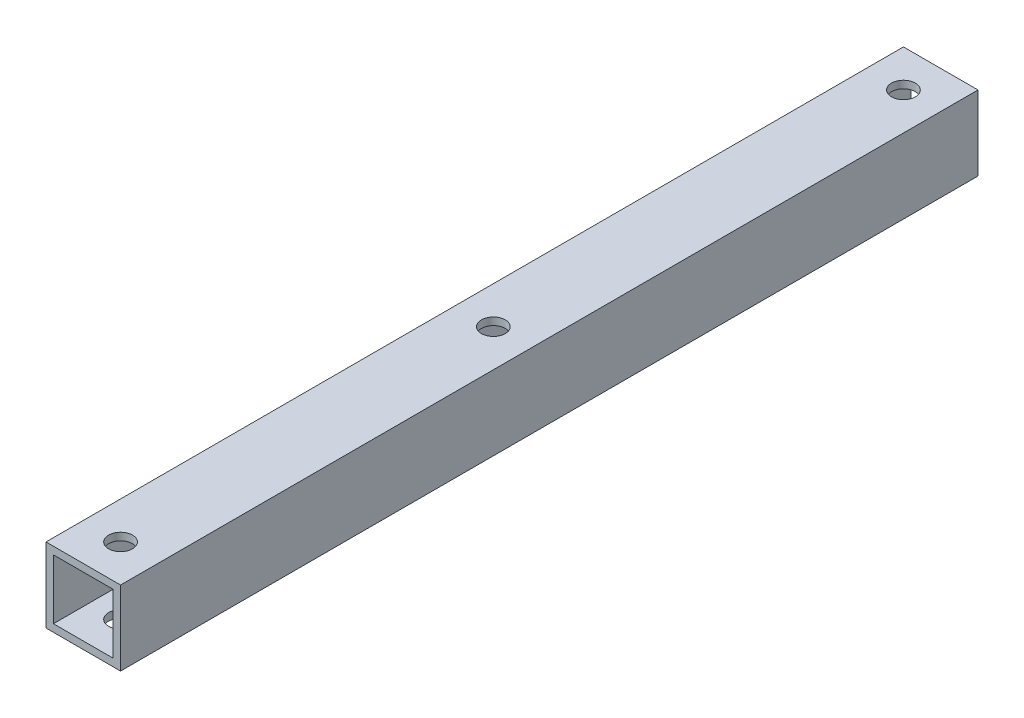
ISO-10303-21;
HEADER;
FILE_DESCRIPTION(('STEP AP214'),'2;1');
FILE_NAME('part.step','',(''),(''),'','','');
FILE_SCHEMA(('AUTOMOTIVE_DESIGN { 1 0 10303 214 1 1 1 1 }'));
ENDSEC;
DATA;
#1=APPLICATION_CONTEXT('core data for automotive mechanical design processes');
#2=APPLICATION_PROTOCOL_DEFINITION('international standard','automotive_design',2000,#1);
#3=PRODUCT_CONTEXT('',#1,'mechanical');
#4=PRODUCT('Part','Part','',(#3));
#5=PRODUCT_RELATED_PRODUCT_CATEGORY('part','',(#4));
#6=PRODUCT_DEFINITION_FORMATION('','',#4);
#7=PRODUCT_DEFINITION_CONTEXT('part definition',#1,'design');
#8=PRODUCT_DEFINITION('design','',#6,#7);
#9=PRODUCT_DEFINITION_SHAPE('','',#8);
#10=(LENGTH_UNIT() NAMED_UNIT(*) SI_UNIT(.MILLI.,.METRE.));
#11=(NAMED_UNIT(*) PLANE_ANGLE_UNIT() SI_UNIT($,.RADIAN.));
#12=(NAMED_UNIT(*) SI_UNIT($,.STERADIAN.) SOLID_ANGLE_UNIT());
#13=UNCERTAINTY_MEASURE_WITH_UNIT(LENGTH_MEASURE(1.E-05),#10,'distance_accuracy_value','');
#14=(GEOMETRIC_REPRESENTATION_CONTEXT(3) GLOBAL_UNCERTAINTY_ASSIGNED_CONTEXT((#13)) GLOBAL_UNIT_ASSIGNED_CONTEXT((#10,
#11,#12)) REPRESENTATION_CONTEXT('',''));
#15=CARTESIAN_POINT('',(0.,0.,0.));
#16=DIRECTION('',(0.,0.,1.));
#17=DIRECTION('',(1.,0.,0.));
#18=AXIS2_PLACEMENT_3D('',#15,#16,#17);
#19=CARTESIAN_POINT('',(0.,0.,115.));
#20=DIRECTION('',(0.,0.,1.));
#21=DIRECTION('',(1.,0.,0.));
#22=AXIS2_PLACEMENT_3D('',#19,#20,#21);
#23=PLANE('',#22);
#24=DIRECTION('',(0.,1.,0.));
#25=VECTOR('',#24,1.);
#26=CARTESIAN_POINT('',(5.,-5.,115.));
#27=LINE('',#26,#25);
#28=CARTESIAN_POINT('',(5.,-5.,115.));
#29=VERTEX_POINT('',#28);
#30=CARTESIAN_POINT('',(5.,5.,115.));
#31=VERTEX_POINT('',#30);
#32=EDGE_CURVE('E164',#29,#31,#27,.T.);
#33=ORIENTED_EDGE('',*,*,#32,.T.);
#34=DIRECTION('',(-1.,0.,0.));
#35=VECTOR('',#34,1.);
#36=CARTESIAN_POINT('',(-5.,5.,115.));
#37=LINE('',#36,#35);
#38=CARTESIAN_POINT('',(-5.,5.,115.));
#39=VERTEX_POINT('',#38);
#40=EDGE_CURVE('E167',#31,#39,#37,.T.);
#41=ORIENTED_EDGE('',*,*,#40,.T.);
#42=DIRECTION('',(0.,-1.,0.));
#43=VECTOR('',#42,1.);
#44=CARTESIAN_POINT('',(-5.,-5.,115.));
#45=LINE('',#44,#43);
#46=CARTESIAN_POINT('',(-5.,-5.,115.));
#47=VERTEX_POINT('',#46);
#48=EDGE_CURVE('E170',#39,#47,#45,.T.);
#49=ORIENTED_EDGE('',*,*,#48,.T.);
#50=DIRECTION('',(1.,0.,0.));
#51=VECTOR('',#50,1.);
#52=CARTESIAN_POINT('',(-5.,-5.,115.));
#53=LINE('',#52,#51);
#54=EDGE_CURVE('E172',#47,#29,#53,.T.);
#55=ORIENTED_EDGE('',*,*,#54,.T.);
#56=EDGE_LOOP('',(#33,#41,#49,#55));
#57=FACE_BOUND('',#56,.T.);
#58=DIRECTION('',(-1.,0.,0.));
#59=VECTOR('',#58,1.);
#60=CARTESIAN_POINT('',(0.,4.,115.));
#61=LINE('',#60,#59);
#62=CARTESIAN_POINT('',(4.,4.,115.));
#63=VERTEX_POINT('',#62);
#64=CARTESIAN_POINT('',(-4.,4.,115.));
#65=VERTEX_POINT('',#64);
#66=EDGE_CURVE('E134',#63,#65,#61,.T.);
#67=ORIENTED_EDGE('',*,*,#66,.F.);
#68=DIRECTION('',(0.,1.,0.));
#69=VECTOR('',#68,1.);
#70=CARTESIAN_POINT('',(4.,0.,115.));
#71=LINE('',#70,#69);
#72=CARTESIAN_POINT('',(4.,-4.,115.));
#73=VERTEX_POINT('',#72);
#74=EDGE_CURVE('E126',#73,#63,#71,.T.);
#75=ORIENTED_EDGE('',*,*,#74,.F.);
#76=DIRECTION('',(1.,0.,0.));
#77=VECTOR('',#76,1.);
#78=CARTESIAN_POINT('',(0.,-4.,115.));
#79=LINE('',#78,#77);
#80=CARTESIAN_POINT('',(-4.,-4.,115.));
#81=VERTEX_POINT('',#80);
#82=EDGE_CURVE('E148',#81,#73,#79,.T.);
#83=ORIENTED_EDGE('',*,*,#82,.F.);
#84=DIRECTION('',(0.,-1.,0.));
#85=VECTOR('',#84,1.);
#86=CARTESIAN_POINT('',(-4.,0.,115.));
#87=LINE('',#86,#85);
#88=EDGE_CURVE('E146',#65,#81,#87,.T.);
#89=ORIENTED_EDGE('',*,*,#88,.F.);
#90=EDGE_LOOP('',(#67,#75,#83,#89));
#91=FACE_BOUND('',#90,.T.);
#92=ADVANCED_FACE('F59',(#57,#91),#23,.T.);
#93=CARTESIAN_POINT('',(0.,0.,0.));
#94=DIRECTION('',(0.,0.,1.));
#95=DIRECTION('',(1.,0.,0.));
#96=AXIS2_PLACEMENT_3D('',#93,#94,#95);
#97=PLANE('',#96);
#98=DIRECTION('',(0.,1.,0.));
#99=VECTOR('',#98,1.);
#100=CARTESIAN_POINT('',(5.,-5.,0.));
#101=LINE('',#100,#99);
#102=CARTESIAN_POINT('',(5.,-5.,0.));
#103=VERTEX_POINT('',#102);
#104=CARTESIAN_POINT('',(5.,5.,0.));
#105=VERTEX_POINT('',#104);
#106=EDGE_CURVE('E142',#103,#105,#101,.T.);
#107=ORIENTED_EDGE('',*,*,#106,.F.);
#108=DIRECTION('',(1.,0.,0.));
#109=VECTOR('',#108,1.);
#110=CARTESIAN_POINT('',(-5.,-5.,0.));
#111=LINE('',#110,#109);
#112=CARTESIAN_POINT('',(-5.,-5.,0.));
#113=VERTEX_POINT('',#112);
#114=EDGE_CURVE('E168',#113,#103,#111,.T.);
#115=ORIENTED_EDGE('',*,*,#114,.F.);
#116=DIRECTION('',(0.,-1.,0.));
#117=VECTOR('',#116,1.);
#118=CARTESIAN_POINT('',(-5.,-5.,0.));
#119=LINE('',#118,#117);
#120=CARTESIAN_POINT('',(-5.,5.,0.));
#121=VERTEX_POINT('',#120);
#122=EDGE_CURVE('E179',#121,#113,#119,.T.);
#123=ORIENTED_EDGE('',*,*,#122,.F.);
#124=DIRECTION('',(-1.,0.,0.));
#125=VECTOR('',#124,1.);
#126=CARTESIAN_POINT('',(-5.,5.,0.));
#127=LINE('',#126,#125);
#128=EDGE_CURVE('E177',#105,#121,#127,.T.);
#129=ORIENTED_EDGE('',*,*,#128,.F.);
#130=EDGE_LOOP('',(#107,#115,#123,#129));
#131=FACE_BOUND('',#130,.T.);
#132=DIRECTION('',(0.,1.,0.));
#133=VECTOR('',#132,1.);
#134=CARTESIAN_POINT('',(4.,0.,0.));
#135=LINE('',#134,#133);
#136=CARTESIAN_POINT('',(4.,-4.,0.));
#137=VERTEX_POINT('',#136);
#138=CARTESIAN_POINT('',(4.,4.,0.));
#139=VERTEX_POINT('',#138);
#140=EDGE_CURVE('E84',#137,#139,#135,.T.);
#141=ORIENTED_EDGE('',*,*,#140,.T.);
#142=DIRECTION('',(-1.,0.,0.));
#143=VECTOR('',#142,1.);
#144=CARTESIAN_POINT('',(0.,4.,0.));
#145=LINE('',#144,#143);
#146=CARTESIAN_POINT('',(-4.,4.,0.));
#147=VERTEX_POINT('',#146);
#148=EDGE_CURVE('E141',#139,#147,#145,.T.);
#149=ORIENTED_EDGE('',*,*,#148,.T.);
#150=DIRECTION('',(0.,-1.,0.));
#151=VECTOR('',#150,1.);
#152=CARTESIAN_POINT('',(-4.,0.,0.));
#153=LINE('',#152,#151);
#154=CARTESIAN_POINT('',(-4.,-4.,0.));
#155=VERTEX_POINT('',#154);
#156=EDGE_CURVE('E156',#147,#155,#153,.T.);
#157=ORIENTED_EDGE('',*,*,#156,.T.);
#158=DIRECTION('',(1.,0.,0.));
#159=VECTOR('',#158,1.);
#160=CARTESIAN_POINT('',(0.,-4.,0.));
#161=LINE('',#160,#159);
#162=EDGE_CURVE('E135',#155,#137,#161,.T.);
#163=ORIENTED_EDGE('',*,*,#162,.T.);
#164=EDGE_LOOP('',(#141,#149,#157,#163));
#165=FACE_BOUND('',#164,.T.);
#166=ADVANCED_FACE('F226',(#131,#165),#97,.F.);
#167=CARTESIAN_POINT('',(5.,-5.,115.));
#168=DIRECTION('',(-1.,0.,0.));
#169=DIRECTION('',(0.,0.,1.));
#170=AXIS2_PLACEMENT_3D('',#167,#168,#169);
#171=PLANE('',#170);
#172=ORIENTED_EDGE('',*,*,#106,.T.);
#173=DIRECTION('',(0.,0.,-1.));
#174=VECTOR('',#173,1.);
#175=CARTESIAN_POINT('',(5.,5.,115.));
#176=LINE('',#175,#174);
#177=EDGE_CURVE('E12',#31,#105,#176,.T.);
#178=ORIENTED_EDGE('',*,*,#177,.F.);
#179=ORIENTED_EDGE('',*,*,#32,.F.);
#180=DIRECTION('',(0.,0.,-1.));
#181=VECTOR('',#180,1.);
#182=CARTESIAN_POINT('',(5.,-5.,115.));
#183=LINE('',#182,#181);
#184=EDGE_CURVE('E174',#29,#103,#183,.T.);
#185=ORIENTED_EDGE('',*,*,#184,.T.);
#186=EDGE_LOOP('',(#172,#178,#179,#185));
#187=FACE_BOUND('',#186,.T.);
#188=ADVANCED_FACE('F61',(#187),#171,.F.);
#189=CARTESIAN_POINT('',(-5.,5.,115.));
#190=DIRECTION('',(0.,-1.,0.));
#191=DIRECTION('',(0.,0.,-1.));
#192=AXIS2_PLACEMENT_3D('',#189,#190,#191);
#193=PLANE('',#192);
#194=CARTESIAN_POINT('',(0.,5.,5.));
#195=DIRECTION('',(0.,1.,0.));
#196=DIRECTION('',(0.,0.,1.));
#197=AXIS2_PLACEMENT_3D('',#194,#195,#196);
#198=CIRCLE('',#197,1.6);
#199=CARTESIAN_POINT('',(0.,5.,6.6));
#200=VERTEX_POINT('',#199);
#201=EDGE_CURVE('E262',#200,#200,#198,.T.);
#202=ORIENTED_EDGE('',*,*,#201,.F.);
#203=EDGE_LOOP('',(#202));
#204=FACE_BOUND('',#203,.T.);
#205=CARTESIAN_POINT('',(0.,5.,60.));
#206=DIRECTION('',(0.,1.,0.));
#207=DIRECTION('',(0.,0.,1.));
#208=AXIS2_PLACEMENT_3D('',#205,#206,#207);
#209=CIRCLE('',#208,1.6);
#210=CARTESIAN_POINT('',(0.,5.,61.6));
#211=VERTEX_POINT('',#210);
#212=EDGE_CURVE('E266',#211,#211,#209,.T.);
#213=ORIENTED_EDGE('',*,*,#212,.F.);
#214=EDGE_LOOP('',(#213));
#215=FACE_BOUND('',#214,.T.);
#216=CARTESIAN_POINT('',(0.,5.,110.));
#217=DIRECTION('',(0.,1.,0.));
#218=DIRECTION('',(0.,0.,1.));
#219=AXIS2_PLACEMENT_3D('',#216,#217,#218);
#220=CIRCLE('',#219,1.6);
#221=CARTESIAN_POINT('',(0.,5.,111.6));
#222=VERTEX_POINT('',#221);
#223=EDGE_CURVE('E205',#222,#222,#220,.T.);
#224=ORIENTED_EDGE('',*,*,#223,.F.);
#225=EDGE_LOOP('',(#224));
#226=FACE_BOUND('',#225,.T.);
#227=ORIENTED_EDGE('',*,*,#128,.T.);
#228=DIRECTION('',(0.,0.,-1.));
#229=VECTOR('',#228,1.);
#230=CARTESIAN_POINT('',(-5.,5.,115.));
#231=LINE('',#230,#229);
#232=EDGE_CURVE('E68',#39,#121,#231,.T.);
#233=ORIENTED_EDGE('',*,*,#232,.F.);
#234=ORIENTED_EDGE('',*,*,#40,.F.);
#235=ORIENTED_EDGE('',*,*,#177,.T.);
#236=EDGE_LOOP('',(#227,#233,#234,#235));
#237=FACE_BOUND('',#236,.T.);
#238=ADVANCED_FACE('F251',(#204,#215,#226,#237),#193,.F.);
#239=CARTESIAN_POINT('',(-5.,-5.,115.));
#240=DIRECTION('',(1.,0.,0.));
#241=DIRECTION('',(0.,0.,-1.));
#242=AXIS2_PLACEMENT_3D('',#239,#240,#241);
#243=PLANE('',#242);
#244=ORIENTED_EDGE('',*,*,#122,.T.);
#245=DIRECTION('',(0.,0.,-1.));
#246=VECTOR('',#245,1.);
#247=CARTESIAN_POINT('',(-5.,-5.,115.));
#248=LINE('',#247,#246);
#249=EDGE_CURVE('E184',#47,#113,#248,.T.);
#250=ORIENTED_EDGE('',*,*,#249,.F.);
#251=ORIENTED_EDGE('',*,*,#48,.F.);
#252=ORIENTED_EDGE('',*,*,#232,.T.);
#253=EDGE_LOOP('',(#244,#250,#251,#252));
#254=FACE_BOUND('',#253,.T.);
#255=ADVANCED_FACE('F248',(#254),#243,.F.);
#256=CARTESIAN_POINT('',(-5.,-5.,115.));
#257=DIRECTION('',(0.,1.,0.));
#258=DIRECTION('',(0.,0.,1.));
#259=AXIS2_PLACEMENT_3D('',#256,#257,#258);
#260=PLANE('',#259);
#261=CARTESIAN_POINT('',(0.,-5.,5.));
#262=DIRECTION('',(0.,1.,0.));
#263=DIRECTION('',(0.,0.,1.));
#264=AXIS2_PLACEMENT_3D('',#261,#262,#263);
#265=CIRCLE('',#264,1.6);
#266=CARTESIAN_POINT('',(0.,-5.,6.6));
#267=VERTEX_POINT('',#266);
#268=EDGE_CURVE('E192',#267,#267,#265,.T.);
#269=ORIENTED_EDGE('',*,*,#268,.T.);
#270=EDGE_LOOP('',(#269));
#271=FACE_BOUND('',#270,.T.);
#272=CARTESIAN_POINT('',(0.,-5.,60.));
#273=DIRECTION('',(0.,1.,0.));
#274=DIRECTION('',(0.,0.,1.));
#275=AXIS2_PLACEMENT_3D('',#272,#273,#274);
#276=CIRCLE('',#275,1.6);
#277=CARTESIAN_POINT('',(0.,-5.,61.6));
#278=VERTEX_POINT('',#277);
#279=EDGE_CURVE('E286',#278,#278,#276,.T.);
#280=ORIENTED_EDGE('',*,*,#279,.T.);
#281=EDGE_LOOP('',(#280));
#282=FACE_BOUND('',#281,.T.);
#283=CARTESIAN_POINT('',(0.,-5.,110.));
#284=DIRECTION('',(0.,1.,0.));
#285=DIRECTION('',(0.,0.,1.));
#286=AXIS2_PLACEMENT_3D('',#283,#284,#285);
#287=CIRCLE('',#286,1.6);
#288=CARTESIAN_POINT('',(0.,-5.,111.6));
#289=VERTEX_POINT('',#288);
#290=EDGE_CURVE('E282',#289,#289,#287,.T.);
#291=ORIENTED_EDGE('',*,*,#290,.T.);
#292=EDGE_LOOP('',(#291));
#293=FACE_BOUND('',#292,.T.);
#294=ORIENTED_EDGE('',*,*,#114,.T.);
#295=ORIENTED_EDGE('',*,*,#184,.F.);
#296=ORIENTED_EDGE('',*,*,#54,.F.);
#297=ORIENTED_EDGE('',*,*,#249,.T.);
#298=EDGE_LOOP('',(#294,#295,#296,#297));
#299=FACE_BOUND('',#298,.T.);
#300=ADVANCED_FACE('F245',(#271,#282,#293,#299),#260,.F.);
#301=CARTESIAN_POINT('',(4.,0.,115.));
#302=DIRECTION('',(-1.,0.,0.));
#303=DIRECTION('',(0.,0.,1.));
#304=AXIS2_PLACEMENT_3D('',#301,#302,#303);
#305=PLANE('',#304);
#306=ORIENTED_EDGE('',*,*,#140,.F.);
#307=DIRECTION('',(0.,0.,-1.));
#308=VECTOR('',#307,1.);
#309=CARTESIAN_POINT('',(4.,-4.,115.));
#310=LINE('',#309,#308);
#311=EDGE_CURVE('E130',#73,#137,#310,.T.);
#312=ORIENTED_EDGE('',*,*,#311,.F.);
#313=ORIENTED_EDGE('',*,*,#74,.T.);
#314=DIRECTION('',(0.,0.,-1.));
#315=VECTOR('',#314,1.);
#316=CARTESIAN_POINT('',(4.,4.,115.));
#317=LINE('',#316,#315);
#318=EDGE_CURVE('E129',#63,#139,#317,.T.);
#319=ORIENTED_EDGE('',*,*,#318,.T.);
#320=EDGE_LOOP('',(#306,#312,#313,#319));
#321=FACE_BOUND('',#320,.T.);
#322=ADVANCED_FACE('F128',(#321),#305,.T.);
#323=CARTESIAN_POINT('',(0.,4.,115.));
#324=DIRECTION('',(0.,-1.,0.));
#325=DIRECTION('',(0.,0.,-1.));
#326=AXIS2_PLACEMENT_3D('',#323,#324,#325);
#327=PLANE('',#326);
#328=CARTESIAN_POINT('',(0.,4.,5.));
#329=DIRECTION('',(0.,-1.,0.));
#330=DIRECTION('',(0.,0.,-1.));
#331=AXIS2_PLACEMENT_3D('',#328,#329,#330);
#332=CIRCLE('',#331,1.6);
#333=CARTESIAN_POINT('',(0.,4.,3.4));
#334=VERTEX_POINT('',#333);
#335=EDGE_CURVE('E154',#334,#334,#332,.T.);
#336=ORIENTED_EDGE('',*,*,#335,.F.);
#337=EDGE_LOOP('',(#336));
#338=FACE_BOUND('',#337,.T.);
#339=CARTESIAN_POINT('',(0.,4.,60.));
#340=DIRECTION('',(0.,-1.,0.));
#341=DIRECTION('',(0.,0.,-1.));
#342=AXIS2_PLACEMENT_3D('',#339,#340,#341);
#343=CIRCLE('',#342,1.6);
#344=CARTESIAN_POINT('',(0.,4.,58.4));
#345=VERTEX_POINT('',#344);
#346=EDGE_CURVE('E195',#345,#345,#343,.T.);
#347=ORIENTED_EDGE('',*,*,#346,.F.);
#348=EDGE_LOOP('',(#347));
#349=FACE_BOUND('',#348,.T.);
#350=CARTESIAN_POINT('',(0.,4.,110.));
#351=DIRECTION('',(0.,-1.,0.));
#352=DIRECTION('',(0.,0.,-1.));
#353=AXIS2_PLACEMENT_3D('',#350,#351,#352);
#354=CIRCLE('',#353,1.6);
#355=CARTESIAN_POINT('',(0.,4.,108.4));
#356=VERTEX_POINT('',#355);
#357=EDGE_CURVE('E191',#356,#356,#354,.T.);
#358=ORIENTED_EDGE('',*,*,#357,.F.);
#359=EDGE_LOOP('',(#358));
#360=FACE_BOUND('',#359,.T.);
#361=ORIENTED_EDGE('',*,*,#148,.F.);
#362=ORIENTED_EDGE('',*,*,#318,.F.);
#363=ORIENTED_EDGE('',*,*,#66,.T.);
#364=DIRECTION('',(0.,0.,-1.));
#365=VECTOR('',#364,1.);
#366=CARTESIAN_POINT('',(-4.,4.,115.));
#367=LINE('',#366,#365);
#368=EDGE_CURVE('E143',#65,#147,#367,.T.);
#369=ORIENTED_EDGE('',*,*,#368,.T.);
#370=EDGE_LOOP('',(#361,#362,#363,#369));
#371=FACE_BOUND('',#370,.T.);
#372=ADVANCED_FACE('F138',(#338,#349,#360,#371),#327,.T.);
#373=CARTESIAN_POINT('',(-4.,0.,115.));
#374=DIRECTION('',(1.,0.,0.));
#375=DIRECTION('',(0.,0.,-1.));
#376=AXIS2_PLACEMENT_3D('',#373,#374,#375);
#377=PLANE('',#376);
#378=ORIENTED_EDGE('',*,*,#156,.F.);
#379=ORIENTED_EDGE('',*,*,#368,.F.);
#380=ORIENTED_EDGE('',*,*,#88,.T.);
#381=DIRECTION('',(0.,0.,-1.));
#382=VECTOR('',#381,1.);
#383=CARTESIAN_POINT('',(-4.,-4.,115.));
#384=LINE('',#383,#382);
#385=EDGE_CURVE('E76',#81,#155,#384,.T.);
#386=ORIENTED_EDGE('',*,*,#385,.T.);
#387=EDGE_LOOP('',(#378,#379,#380,#386));
#388=FACE_BOUND('',#387,.T.);
#389=ADVANCED_FACE('F220',(#388),#377,.T.);
#390=CARTESIAN_POINT('',(0.,-4.,115.));
#391=DIRECTION('',(0.,1.,0.));
#392=DIRECTION('',(0.,0.,1.));
#393=AXIS2_PLACEMENT_3D('',#390,#391,#392);
#394=PLANE('',#393);
#395=CARTESIAN_POINT('',(0.,-4.,5.));
#396=DIRECTION('',(0.,1.,0.));
#397=DIRECTION('',(0.,0.,1.));
#398=AXIS2_PLACEMENT_3D('',#395,#396,#397);
#399=CIRCLE('',#398,1.6);
#400=CARTESIAN_POINT('',(0.,-4.,6.6));
#401=VERTEX_POINT('',#400);
#402=EDGE_CURVE('E63',#401,#401,#399,.T.);
#403=ORIENTED_EDGE('',*,*,#402,.F.);
#404=EDGE_LOOP('',(#403));
#405=FACE_BOUND('',#404,.T.);
#406=CARTESIAN_POINT('',(0.,-4.,60.));
#407=DIRECTION('',(0.,1.,0.));
#408=DIRECTION('',(0.,0.,1.));
#409=AXIS2_PLACEMENT_3D('',#406,#407,#408);
#410=CIRCLE('',#409,1.6);
#411=CARTESIAN_POINT('',(0.,-4.,61.6));
#412=VERTEX_POINT('',#411);
#413=EDGE_CURVE('E193',#412,#412,#410,.T.);
#414=ORIENTED_EDGE('',*,*,#413,.F.);
#415=EDGE_LOOP('',(#414));
#416=FACE_BOUND('',#415,.T.);
#417=CARTESIAN_POINT('',(0.,-4.,110.));
#418=DIRECTION('',(0.,1.,0.));
#419=DIRECTION('',(0.,0.,1.));
#420=AXIS2_PLACEMENT_3D('',#417,#418,#419);
#421=CIRCLE('',#420,1.6);
#422=CARTESIAN_POINT('',(0.,-4.,111.6));
#423=VERTEX_POINT('',#422);
#424=EDGE_CURVE('E189',#423,#423,#421,.T.);
#425=ORIENTED_EDGE('',*,*,#424,.F.);
#426=EDGE_LOOP('',(#425));
#427=FACE_BOUND('',#426,.T.);
#428=ORIENTED_EDGE('',*,*,#162,.F.);
#429=ORIENTED_EDGE('',*,*,#385,.F.);
#430=ORIENTED_EDGE('',*,*,#82,.T.);
#431=ORIENTED_EDGE('',*,*,#311,.T.);
#432=EDGE_LOOP('',(#428,#429,#430,#431));
#433=FACE_BOUND('',#432,.T.);
#434=ADVANCED_FACE('F216',(#405,#416,#427,#433),#394,.T.);
#435=CARTESIAN_POINT('',(0.,-5.,110.));
#436=DIRECTION('',(0.,1.,0.));
#437=DIRECTION('',(0.,0.,1.));
#438=AXIS2_PLACEMENT_3D('',#435,#436,#437);
#439=CYLINDRICAL_SURFACE('',#438,1.6);
#440=ORIENTED_EDGE('',*,*,#424,.T.);
#441=EDGE_LOOP('',(#440));
#442=FACE_BOUND('',#441,.T.);
#443=ORIENTED_EDGE('',*,*,#290,.F.);
#444=EDGE_LOOP('',(#443));
#445=FACE_BOUND('',#444,.T.);
#446=ADVANCED_FACE('F219',(#442,#445),#439,.F.);
#447=CARTESIAN_POINT('',(0.,-5.,60.));
#448=DIRECTION('',(0.,1.,0.));
#449=DIRECTION('',(0.,0.,1.));
#450=AXIS2_PLACEMENT_3D('',#447,#448,#449);
#451=CYLINDRICAL_SURFACE('',#450,1.6);
#452=ORIENTED_EDGE('',*,*,#413,.T.);
#453=EDGE_LOOP('',(#452));
#454=FACE_BOUND('',#453,.T.);
#455=ORIENTED_EDGE('',*,*,#279,.F.);
#456=EDGE_LOOP('',(#455));
#457=FACE_BOUND('',#456,.T.);
#458=ADVANCED_FACE('F297',(#454,#457),#451,.F.);
#459=CARTESIAN_POINT('',(0.,-5.,5.));
#460=DIRECTION('',(0.,1.,0.));
#461=DIRECTION('',(0.,0.,1.));
#462=AXIS2_PLACEMENT_3D('',#459,#460,#461);
#463=CYLINDRICAL_SURFACE('',#462,1.6);
#464=ORIENTED_EDGE('',*,*,#402,.T.);
#465=EDGE_LOOP('',(#464));
#466=FACE_BOUND('',#465,.T.);
#467=ORIENTED_EDGE('',*,*,#268,.F.);
#468=EDGE_LOOP('',(#467));
#469=FACE_BOUND('',#468,.T.);
#470=ADVANCED_FACE('F213',(#466,#469),#463,.F.);
#471=ORIENTED_EDGE('',*,*,#357,.T.);
#472=EDGE_LOOP('',(#471));
#473=FACE_BOUND('',#472,.T.);
#474=ORIENTED_EDGE('',*,*,#223,.T.);
#475=EDGE_LOOP('',(#474));
#476=FACE_BOUND('',#475,.T.);
#477=ADVANCED_FACE('F296',(#473,#476),#439,.F.);
#478=ORIENTED_EDGE('',*,*,#346,.T.);
#479=EDGE_LOOP('',(#478));
#480=FACE_BOUND('',#479,.T.);
#481=ORIENTED_EDGE('',*,*,#212,.T.);
#482=EDGE_LOOP('',(#481));
#483=FACE_BOUND('',#482,.T.);
#484=ADVANCED_FACE('F304',(#480,#483),#451,.F.);
#485=ORIENTED_EDGE('',*,*,#335,.T.);
#486=EDGE_LOOP('',(#485));
#487=FACE_BOUND('',#486,.T.);
#488=ORIENTED_EDGE('',*,*,#201,.T.);
#489=EDGE_LOOP('',(#488));
#490=FACE_BOUND('',#489,.T.);
#491=ADVANCED_FACE('F299',(#487,#490),#463,.F.);
#492=CLOSED_SHELL('',(#92,#166,#188,#238,#255,#300,#322,#372,#389,#434,#446,#458,#470,#477,#484,#491));
#493=MANIFOLD_SOLID_BREP('B2',#492);
#494=ADVANCED_BREP_SHAPE_REPRESENTATION('',(#18,#493),#14);
#495=SHAPE_DEFINITION_REPRESENTATION(#9,#494);
ENDSEC;
END-ISO-10303-21;
